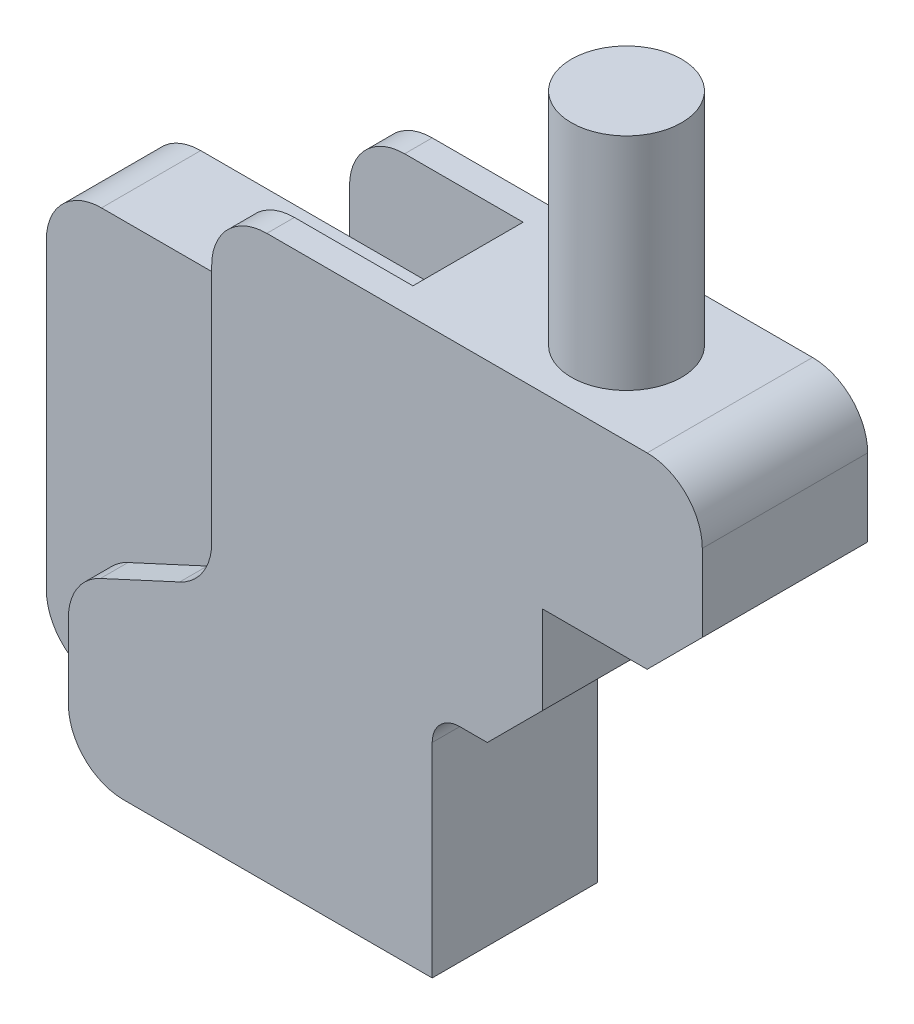
ISO-10303-21;
HEADER;
FILE_DESCRIPTION(('STEP AP214'),'2;1');
FILE_NAME('part.step','',(''),(''),'','','');
FILE_SCHEMA(('AUTOMOTIVE_DESIGN { 1 0 10303 214 1 1 1 1 }'));
ENDSEC;
DATA;
#1=APPLICATION_CONTEXT('core data for automotive mechanical design processes');
#2=APPLICATION_PROTOCOL_DEFINITION('international standard','automotive_design',2000,#1);
#3=PRODUCT_CONTEXT('',#1,'mechanical');
#4=PRODUCT('Part','Part','',(#3));
#5=PRODUCT_RELATED_PRODUCT_CATEGORY('part','',(#4));
#6=PRODUCT_DEFINITION_FORMATION('','',#4);
#7=PRODUCT_DEFINITION_CONTEXT('part definition',#1,'design');
#8=PRODUCT_DEFINITION('design','',#6,#7);
#9=PRODUCT_DEFINITION_SHAPE('','',#8);
#10=(LENGTH_UNIT() NAMED_UNIT(*) SI_UNIT(.MILLI.,.METRE.));
#11=(NAMED_UNIT(*) PLANE_ANGLE_UNIT() SI_UNIT($,.RADIAN.));
#12=(NAMED_UNIT(*) SI_UNIT($,.STERADIAN.) SOLID_ANGLE_UNIT());
#13=UNCERTAINTY_MEASURE_WITH_UNIT(LENGTH_MEASURE(1.E-05),#10,'distance_accuracy_value','');
#14=(GEOMETRIC_REPRESENTATION_CONTEXT(3) GLOBAL_UNCERTAINTY_ASSIGNED_CONTEXT((#13)) GLOBAL_UNIT_ASSIGNED_CONTEXT((#10,
#11,#12)) REPRESENTATION_CONTEXT('',''));
#15=CARTESIAN_POINT('',(0.,0.,0.));
#16=DIRECTION('',(0.,0.,1.));
#17=DIRECTION('',(1.,0.,0.));
#18=AXIS2_PLACEMENT_3D('',#15,#16,#17);
#19=CARTESIAN_POINT('',(0.,-41.,0.));
#20=DIRECTION('',(0.,1.,0.));
#21=DIRECTION('',(-1.,0.,0.));
#22=AXIS2_PLACEMENT_3D('',#19,#20,#21);
#23=PLANE('',#22);
#24=DIRECTION('',(0.,0.,-1.));
#25=VECTOR('',#24,1.);
#26=CARTESIAN_POINT('',(-57.5,-41.,30.));
#27=LINE('',#26,#25);
#28=CARTESIAN_POINT('',(-57.5,-41.,6.));
#29=VERTEX_POINT('',#28);
#30=CARTESIAN_POINT('',(-57.5,-41.,5.));
#31=VERTEX_POINT('',#30);
#32=EDGE_CURVE('E521',#29,#31,#27,.T.);
#33=ORIENTED_EDGE('',*,*,#32,.F.);
#34=DIRECTION('',(-1.,0.,0.));
#35=VECTOR('',#34,1.);
#36=CARTESIAN_POINT('',(-67.5,-41.,6.));
#37=LINE('',#36,#35);
#38=CARTESIAN_POINT('',(-1.00000000000001,-41.,6.));
#39=VERTEX_POINT('',#38);
#40=EDGE_CURVE('E271',#39,#29,#37,.T.);
#41=ORIENTED_EDGE('',*,*,#40,.F.);
#42=DIRECTION('',(0.,0.,-1.));
#43=VECTOR('',#42,1.);
#44=CARTESIAN_POINT('',(-1.00000000000001,-41.,6.));
#45=LINE('',#44,#43);
#46=CARTESIAN_POINT('',(-1.00000000000001,-41.,24.));
#47=VERTEX_POINT('',#46);
#48=EDGE_CURVE('E275',#47,#39,#45,.T.);
#49=ORIENTED_EDGE('',*,*,#48,.F.);
#50=DIRECTION('',(-1.,0.,0.));
#51=VECTOR('',#50,1.);
#52=CARTESIAN_POINT('',(0.,-41.,24.));
#53=LINE('',#52,#51);
#54=CARTESIAN_POINT('',(-57.5,-41.,24.));
#55=VERTEX_POINT('',#54);
#56=EDGE_CURVE('E567',#47,#55,#53,.T.);
#57=ORIENTED_EDGE('',*,*,#56,.T.);
#58=CARTESIAN_POINT('',(-57.5,-41.,25.));
#59=VERTEX_POINT('',#58);
#60=EDGE_CURVE('E520',#59,#55,#27,.T.);
#61=ORIENTED_EDGE('',*,*,#60,.F.);
#62=DIRECTION('',(1.,0.,0.));
#63=VECTOR('',#62,1.);
#64=CARTESIAN_POINT('',(-61.9360451220486,-41.,25.));
#65=LINE('',#64,#63);
#66=CARTESIAN_POINT('',(0.,-41.,25.));
#67=VERTEX_POINT('',#66);
#68=EDGE_CURVE('E299',#59,#67,#65,.T.);
#69=ORIENTED_EDGE('',*,*,#68,.T.);
#70=DIRECTION('',(0.,0.,-1.));
#71=VECTOR('',#70,1.);
#72=CARTESIAN_POINT('',(0.,-41.,5.));
#73=LINE('',#72,#71);
#74=CARTESIAN_POINT('',(0.,-41.,5.));
#75=VERTEX_POINT('',#74);
#76=EDGE_CURVE('E290',#67,#75,#73,.T.);
#77=ORIENTED_EDGE('',*,*,#76,.T.);
#78=DIRECTION('',(-1.,0.,0.));
#79=VECTOR('',#78,1.);
#80=CARTESIAN_POINT('',(-61.9360451220486,-41.,5.));
#81=LINE('',#80,#79);
#82=EDGE_CURVE('E294',#75,#31,#81,.T.);
#83=ORIENTED_EDGE('',*,*,#82,.T.);
#84=EDGE_LOOP('',(#33,#41,#49,#57,#61,#69,#77,#83));
#85=FACE_BOUND('',#84,.T.);
#86=ADVANCED_FACE('F38',(#85),#23,.T.);
#87=CARTESIAN_POINT('',(-21.5,41.,30.));
#88=DIRECTION('',(0.,0.,-1.));
#89=DIRECTION('',(-1.,0.,0.));
#90=AXIS2_PLACEMENT_3D('',#87,#88,#89);
#91=CYLINDRICAL_SURFACE('',#90,10.);
#92=DIRECTION('',(0.,0.,-1.));
#93=VECTOR('',#92,1.);
#94=CARTESIAN_POINT('',(-21.4999999999999,51.,30.));
#95=LINE('',#94,#93);
#96=CARTESIAN_POINT('',(-21.4999999999999,51.,30.));
#97=VERTEX_POINT('',#96);
#98=CARTESIAN_POINT('',(-21.5,51.,25.));
#99=VERTEX_POINT('',#98);
#100=EDGE_CURVE('E547',#97,#99,#95,.T.);
#101=ORIENTED_EDGE('',*,*,#100,.T.);
#102=CARTESIAN_POINT('',(-21.5,41.,25.));
#103=DIRECTION('',(0.,0.,1.));
#104=DIRECTION('',(1.,0.,0.));
#105=AXIS2_PLACEMENT_3D('',#102,#103,#104);
#106=CIRCLE('',#105,10.);
#107=CARTESIAN_POINT('',(-31.5,40.9999999999999,25.));
#108=VERTEX_POINT('',#107);
#109=EDGE_CURVE('E361',#99,#108,#106,.T.);
#110=ORIENTED_EDGE('',*,*,#109,.T.);
#111=DIRECTION('',(0.,0.,-1.));
#112=VECTOR('',#111,1.);
#113=CARTESIAN_POINT('',(-31.5,40.9999999999999,30.));
#114=LINE('',#113,#112);
#115=CARTESIAN_POINT('',(-31.5,40.9999999999999,30.));
#116=VERTEX_POINT('',#115);
#117=EDGE_CURVE('E542',#116,#108,#114,.T.);
#118=ORIENTED_EDGE('',*,*,#117,.F.);
#119=CARTESIAN_POINT('',(-21.5,41.,30.));
#120=DIRECTION('',(0.,0.,1.));
#121=DIRECTION('',(-1.,0.,0.));
#122=AXIS2_PLACEMENT_3D('',#119,#120,#121);
#123=CIRCLE('',#122,10.);
#124=EDGE_CURVE('E380',#97,#116,#123,.T.);
#125=ORIENTED_EDGE('',*,*,#124,.F.);
#126=EDGE_LOOP('',(#101,#110,#118,#125));
#127=FACE_BOUND('',#126,.T.);
#128=ADVANCED_FACE('F658',(#127),#91,.T.);
#129=CARTESIAN_POINT('',(-31.5,-2.60167610517199,30.));
#130=DIRECTION('',(1.,0.,0.));
#131=DIRECTION('',(0.,1.,0.));
#132=AXIS2_PLACEMENT_3D('',#129,#130,#131);
#133=PLANE('',#132);
#134=ORIENTED_EDGE('',*,*,#117,.T.);
#135=DIRECTION('',(0.,-1.,0.));
#136=VECTOR('',#135,1.);
#137=CARTESIAN_POINT('',(-31.5,-2.60167610517199,25.));
#138=LINE('',#137,#136);
#139=CARTESIAN_POINT('',(-31.5,-2.60167610517204,25.));
#140=VERTEX_POINT('',#139);
#141=EDGE_CURVE('E357',#108,#140,#138,.T.);
#142=ORIENTED_EDGE('',*,*,#141,.T.);
#143=DIRECTION('',(0.,0.,-1.));
#144=VECTOR('',#143,1.);
#145=CARTESIAN_POINT('',(-31.5,-2.60167610517204,30.));
#146=LINE('',#145,#144);
#147=CARTESIAN_POINT('',(-31.5,-2.60167610517204,30.));
#148=VERTEX_POINT('',#147);
#149=EDGE_CURVE('E537',#148,#140,#146,.T.);
#150=ORIENTED_EDGE('',*,*,#149,.F.);
#151=DIRECTION('',(0.,-1.,0.));
#152=VECTOR('',#151,1.);
#153=CARTESIAN_POINT('',(-31.5,-2.60167610517199,30.));
#154=LINE('',#153,#152);
#155=EDGE_CURVE('E383',#116,#148,#154,.T.);
#156=ORIENTED_EDGE('',*,*,#155,.F.);
#157=EDGE_LOOP('',(#134,#142,#150,#156));
#158=FACE_BOUND('',#157,.T.);
#159=ADVANCED_FACE('F654',(#158),#133,.F.);
#160=CARTESIAN_POINT('',(-41.5,-2.60167610517204,30.));
#161=DIRECTION('',(0.,0.,-1.));
#162=DIRECTION('',(-1.,0.,0.));
#163=AXIS2_PLACEMENT_3D('',#160,#161,#162);
#164=CYLINDRICAL_SURFACE('',#163,9.99999999999999);
#165=ORIENTED_EDGE('',*,*,#149,.T.);
#166=CARTESIAN_POINT('',(-41.5,-2.60167610517204,25.));
#167=DIRECTION('',(0.,0.,1.));
#168=DIRECTION('',(1.,0.,0.));
#169=AXIS2_PLACEMENT_3D('',#166,#167,#168);
#170=CIRCLE('',#169,9.99999999999999);
#171=CARTESIAN_POINT('',(-37.3094182253826,-11.6812699501766,25.));
#172=VERTEX_POINT('',#171);
#173=EDGE_CURVE('E353',#140,#172,#170,.F.);
#174=ORIENTED_EDGE('',*,*,#173,.T.);
#175=DIRECTION('',(0.,0.,-1.));
#176=VECTOR('',#175,1.);
#177=CARTESIAN_POINT('',(-37.3094182253826,-11.6812699501766,30.));
#178=LINE('',#177,#176);
#179=CARTESIAN_POINT('',(-37.3094182253826,-11.6812699501766,30.));
#180=VERTEX_POINT('',#179);
#181=EDGE_CURVE('E532',#180,#172,#178,.T.);
#182=ORIENTED_EDGE('',*,*,#181,.F.);
#183=CARTESIAN_POINT('',(-41.5,-2.60167610517204,30.));
#184=DIRECTION('',(0.,0.,-1.));
#185=DIRECTION('',(1.,0.,0.));
#186=AXIS2_PLACEMENT_3D('',#183,#184,#185);
#187=CIRCLE('',#186,9.99999999999999);
#188=EDGE_CURVE('E386',#148,#180,#187,.T.);
#189=ORIENTED_EDGE('',*,*,#188,.F.);
#190=EDGE_LOOP('',(#165,#174,#182,#189));
#191=FACE_BOUND('',#190,.T.);
#192=ADVANCED_FACE('F649',(#191),#164,.F.);
#193=CARTESIAN_POINT('',(-51.6905817746174,-18.3187300498234,30.));
#194=DIRECTION('',(0.419058177461748,-0.907959384500451,0.));
#195=DIRECTION('',(0.907959384500451,0.419058177461748,0.));
#196=AXIS2_PLACEMENT_3D('',#193,#194,#195);
#197=PLANE('',#196);
#198=ORIENTED_EDGE('',*,*,#181,.T.);
#199=DIRECTION('',(-0.907959384500451,-0.419058177461748,0.));
#200=VECTOR('',#199,1.);
#201=CARTESIAN_POINT('',(-51.6905817746174,-18.3187300498234,25.));
#202=LINE('',#201,#200);
#203=CARTESIAN_POINT('',(-51.6905817746174,-18.3187300498234,25.));
#204=VERTEX_POINT('',#203);
#205=EDGE_CURVE('E349',#172,#204,#202,.T.);
#206=ORIENTED_EDGE('',*,*,#205,.T.);
#207=DIRECTION('',(0.,0.,-1.));
#208=VECTOR('',#207,1.);
#209=CARTESIAN_POINT('',(-51.6905817746174,-18.3187300498234,30.));
#210=LINE('',#209,#208);
#211=CARTESIAN_POINT('',(-51.6905817746174,-18.3187300498234,30.));
#212=VERTEX_POINT('',#211);
#213=EDGE_CURVE('E527',#212,#204,#210,.T.);
#214=ORIENTED_EDGE('',*,*,#213,.F.);
#215=DIRECTION('',(-0.907959384500451,-0.419058177461748,0.));
#216=VECTOR('',#215,1.);
#217=CARTESIAN_POINT('',(-51.6905817746174,-18.3187300498234,30.));
#218=LINE('',#217,#216);
#219=EDGE_CURVE('E389',#180,#212,#218,.T.);
#220=ORIENTED_EDGE('',*,*,#219,.F.);
#221=EDGE_LOOP('',(#198,#206,#214,#220));
#222=FACE_BOUND('',#221,.T.);
#223=ADVANCED_FACE('F646',(#222),#197,.F.);
#224=CARTESIAN_POINT('',(-47.5,-27.398323894828,30.));
#225=DIRECTION('',(0.,0.,-1.));
#226=DIRECTION('',(-1.,0.,0.));
#227=AXIS2_PLACEMENT_3D('',#224,#225,#226);
#228=CYLINDRICAL_SURFACE('',#227,10.);
#229=ORIENTED_EDGE('',*,*,#213,.T.);
#230=CARTESIAN_POINT('',(-47.5,-27.398323894828,25.));
#231=DIRECTION('',(0.,0.,1.));
#232=DIRECTION('',(1.,0.,0.));
#233=AXIS2_PLACEMENT_3D('',#230,#231,#232);
#234=CIRCLE('',#233,10.);
#235=CARTESIAN_POINT('',(-57.5,-27.398323894828,25.));
#236=VERTEX_POINT('',#235);
#237=EDGE_CURVE('E345',#204,#236,#234,.T.);
#238=ORIENTED_EDGE('',*,*,#237,.T.);
#239=DIRECTION('',(0.,0.,-1.));
#240=VECTOR('',#239,1.);
#241=CARTESIAN_POINT('',(-57.5,-27.398323894828,30.));
#242=LINE('',#241,#240);
#243=CARTESIAN_POINT('',(-57.5,-27.398323894828,30.));
#244=VERTEX_POINT('',#243);
#245=EDGE_CURVE('E522',#244,#236,#242,.T.);
#246=ORIENTED_EDGE('',*,*,#245,.F.);
#247=CARTESIAN_POINT('',(-47.5,-27.398323894828,30.));
#248=DIRECTION('',(0.,0.,1.));
#249=DIRECTION('',(-1.,0.,0.));
#250=AXIS2_PLACEMENT_3D('',#247,#248,#249);
#251=CIRCLE('',#250,10.);
#252=EDGE_CURVE('E392',#212,#244,#251,.T.);
#253=ORIENTED_EDGE('',*,*,#252,.F.);
#254=EDGE_LOOP('',(#229,#238,#246,#253));
#255=FACE_BOUND('',#254,.T.);
#256=ADVANCED_FACE('F641',(#255),#228,.T.);
#257=CARTESIAN_POINT('',(-57.5,-40.9999999999999,30.));
#258=DIRECTION('',(1.,0.,0.));
#259=DIRECTION('',(0.,0.,-1.));
#260=AXIS2_PLACEMENT_3D('',#257,#258,#259);
#261=PLANE('',#260);
#262=ORIENTED_EDGE('',*,*,#245,.T.);
#263=DIRECTION('',(0.,-1.,0.));
#264=VECTOR('',#263,1.);
#265=CARTESIAN_POINT('',(-57.5,-40.9999999999999,25.));
#266=LINE('',#265,#264);
#267=EDGE_CURVE('E341',#236,#59,#266,.T.);
#268=ORIENTED_EDGE('',*,*,#267,.T.);
#269=CARTESIAN_POINT('',(-57.5,-41.,30.));
#270=VERTEX_POINT('',#269);
#271=EDGE_CURVE('E515',#270,#59,#27,.T.);
#272=ORIENTED_EDGE('',*,*,#271,.F.);
#273=DIRECTION('',(0.,-1.,0.));
#274=VECTOR('',#273,1.);
#275=CARTESIAN_POINT('',(-57.5,-40.9999999999999,30.));
#276=LINE('',#275,#274);
#277=EDGE_CURVE('E395',#244,#270,#276,.T.);
#278=ORIENTED_EDGE('',*,*,#277,.F.);
#279=EDGE_LOOP('',(#262,#268,#272,#278));
#280=FACE_BOUND('',#279,.T.);
#281=ADVANCED_FACE('F634',(#280),#261,.F.);
#282=CARTESIAN_POINT('',(47.5,17.,30.));
#283=DIRECTION('',(-0.707106781186548,0.707106781186547,0.));
#284=DIRECTION('',(-0.707106781186547,-0.707106781186548,0.));
#285=AXIS2_PLACEMENT_3D('',#282,#283,#284);
#286=PLANE('',#285);
#287=DIRECTION('',(0.707106781186547,0.707106781186548,0.));
#288=VECTOR('',#287,1.);
#289=CARTESIAN_POINT('',(47.5,17.,0.));
#290=LINE('',#289,#288);
#291=CARTESIAN_POINT('',(47.5,17.,0.));
#292=VERTEX_POINT('',#291);
#293=CARTESIAN_POINT('',(57.5,27.,0.));
#294=VERTEX_POINT('',#293);
#295=EDGE_CURVE('E365',#292,#294,#290,.T.);
#296=ORIENTED_EDGE('',*,*,#295,.T.);
#297=DIRECTION('',(0.,0.,-1.));
#298=VECTOR('',#297,1.);
#299=CARTESIAN_POINT('',(57.5,27.,30.));
#300=LINE('',#299,#298);
#301=CARTESIAN_POINT('',(57.5,27.,30.));
#302=VERTEX_POINT('',#301);
#303=EDGE_CURVE('E559',#302,#294,#300,.T.);
#304=ORIENTED_EDGE('',*,*,#303,.F.);
#305=DIRECTION('',(0.707106781186547,0.707106781186548,0.));
#306=VECTOR('',#305,1.);
#307=CARTESIAN_POINT('',(47.5,17.,30.));
#308=LINE('',#307,#306);
#309=CARTESIAN_POINT('',(47.5,17.,30.));
#310=VERTEX_POINT('',#309);
#311=EDGE_CURVE('E366',#310,#302,#308,.T.);
#312=ORIENTED_EDGE('',*,*,#311,.F.);
#313=DIRECTION('',(0.,0.,-1.));
#314=VECTOR('',#313,1.);
#315=CARTESIAN_POINT('',(47.5,17.,30.));
#316=LINE('',#315,#314);
#317=EDGE_CURVE('E422',#310,#292,#316,.T.);
#318=ORIENTED_EDGE('',*,*,#317,.T.);
#319=EDGE_LOOP('',(#296,#304,#312,#318));
#320=FACE_BOUND('',#319,.T.);
#321=ADVANCED_FACE('F773',(#320),#286,.F.);
#322=CARTESIAN_POINT('',(57.5,27.,30.));
#323=DIRECTION('',(-1.,0.,0.));
#324=DIRECTION('',(0.,-1.,0.));
#325=AXIS2_PLACEMENT_3D('',#322,#323,#324);
#326=PLANE('',#325);
#327=DIRECTION('',(0.,1.,0.));
#328=VECTOR('',#327,1.);
#329=CARTESIAN_POINT('',(57.5,27.,0.));
#330=LINE('',#329,#328);
#331=CARTESIAN_POINT('',(57.5,40.9999999999999,0.));
#332=VERTEX_POINT('',#331);
#333=EDGE_CURVE('E426',#294,#332,#330,.T.);
#334=ORIENTED_EDGE('',*,*,#333,.T.);
#335=DIRECTION('',(0.,0.,-1.));
#336=VECTOR('',#335,1.);
#337=CARTESIAN_POINT('',(57.5,40.9999999999999,30.));
#338=LINE('',#337,#336);
#339=CARTESIAN_POINT('',(57.5,40.9999999999999,30.));
#340=VERTEX_POINT('',#339);
#341=EDGE_CURVE('E555',#340,#332,#338,.T.);
#342=ORIENTED_EDGE('',*,*,#341,.F.);
#343=DIRECTION('',(0.,1.,0.));
#344=VECTOR('',#343,1.);
#345=CARTESIAN_POINT('',(57.5,27.,30.));
#346=LINE('',#345,#344);
#347=EDGE_CURVE('E370',#302,#340,#346,.T.);
#348=ORIENTED_EDGE('',*,*,#347,.F.);
#349=ORIENTED_EDGE('',*,*,#303,.T.);
#350=EDGE_LOOP('',(#334,#342,#348,#349));
#351=FACE_BOUND('',#350,.T.);
#352=ADVANCED_FACE('F769',(#351),#326,.F.);
#353=CARTESIAN_POINT('',(47.5,41.,30.));
#354=DIRECTION('',(0.,0.,-1.));
#355=DIRECTION('',(-1.,0.,0.));
#356=AXIS2_PLACEMENT_3D('',#353,#354,#355);
#357=CYLINDRICAL_SURFACE('',#356,10.);
#358=CARTESIAN_POINT('',(47.5,41.,0.));
#359=DIRECTION('',(0.,0.,1.));
#360=DIRECTION('',(1.,0.,0.));
#361=AXIS2_PLACEMENT_3D('',#358,#359,#360);
#362=CIRCLE('',#361,10.);
#363=CARTESIAN_POINT('',(47.4999999999999,51.,0.));
#364=VERTEX_POINT('',#363);
#365=EDGE_CURVE('E429',#332,#364,#362,.T.);
#366=ORIENTED_EDGE('',*,*,#365,.T.);
#367=DIRECTION('',(0.,0.,-1.));
#368=VECTOR('',#367,1.);
#369=CARTESIAN_POINT('',(47.4999999999999,51.,30.));
#370=LINE('',#369,#368);
#371=CARTESIAN_POINT('',(47.4999999999999,51.,30.));
#372=VERTEX_POINT('',#371);
#373=EDGE_CURVE('E551',#372,#364,#370,.T.);
#374=ORIENTED_EDGE('',*,*,#373,.F.);
#375=CARTESIAN_POINT('',(47.5,41.,30.));
#376=DIRECTION('',(0.,0.,1.));
#377=DIRECTION('',(1.,0.,0.));
#378=AXIS2_PLACEMENT_3D('',#375,#376,#377);
#379=CIRCLE('',#378,10.);
#380=EDGE_CURVE('E374',#340,#372,#379,.T.);
#381=ORIENTED_EDGE('',*,*,#380,.F.);
#382=ORIENTED_EDGE('',*,*,#341,.T.);
#383=EDGE_LOOP('',(#366,#374,#381,#382));
#384=FACE_BOUND('',#383,.T.);
#385=ADVANCED_FACE('F765',(#384),#357,.T.);
#386=CARTESIAN_POINT('',(47.4999999999999,51.,30.));
#387=DIRECTION('',(0.,-1.,0.));
#388=DIRECTION('',(1.,0.,0.));
#389=AXIS2_PLACEMENT_3D('',#386,#387,#388);
#390=PLANE('',#389);
#391=CARTESIAN_POINT('',(28.75,51.,15.));
#392=DIRECTION('',(0.,-1.,0.));
#393=DIRECTION('',(1.,0.,0.));
#394=AXIS2_PLACEMENT_3D('',#391,#392,#393);
#395=CIRCLE('',#394,10.);
#396=CARTESIAN_POINT('',(38.75,51.,15.));
#397=VERTEX_POINT('',#396);
#398=EDGE_CURVE('E563',#397,#397,#395,.F.);
#399=ORIENTED_EDGE('',*,*,#398,.F.);
#400=EDGE_LOOP('',(#399));
#401=FACE_BOUND('',#400,.T.);
#402=DIRECTION('',(0.,0.,-1.));
#403=VECTOR('',#402,1.);
#404=CARTESIAN_POINT('',(0.,51.,5.));
#405=LINE('',#404,#403);
#406=CARTESIAN_POINT('',(0.,51.,25.));
#407=VERTEX_POINT('',#406);
#408=CARTESIAN_POINT('',(0.,51.,5.));
#409=VERTEX_POINT('',#408);
#410=EDGE_CURVE('E284',#407,#409,#405,.T.);
#411=ORIENTED_EDGE('',*,*,#410,.F.);
#412=DIRECTION('',(1.,0.,0.));
#413=VECTOR('',#412,1.);
#414=CARTESIAN_POINT('',(-61.9360451220486,51.,25.));
#415=LINE('',#414,#413);
#416=EDGE_CURVE('E295',#99,#407,#415,.T.);
#417=ORIENTED_EDGE('',*,*,#416,.F.);
#418=ORIENTED_EDGE('',*,*,#100,.F.);
#419=DIRECTION('',(-1.,0.,0.));
#420=VECTOR('',#419,1.);
#421=CARTESIAN_POINT('',(47.4999999999999,51.,30.));
#422=LINE('',#421,#420);
#423=EDGE_CURVE('E377',#372,#97,#422,.T.);
#424=ORIENTED_EDGE('',*,*,#423,.F.);
#425=ORIENTED_EDGE('',*,*,#373,.T.);
#426=DIRECTION('',(-1.,0.,0.));
#427=VECTOR('',#426,1.);
#428=CARTESIAN_POINT('',(47.4999999999999,51.,0.));
#429=LINE('',#428,#427);
#430=CARTESIAN_POINT('',(-21.4999999999999,51.,0.));
#431=VERTEX_POINT('',#430);
#432=EDGE_CURVE('E432',#364,#431,#429,.T.);
#433=ORIENTED_EDGE('',*,*,#432,.T.);
#434=CARTESIAN_POINT('',(-21.5,51.,5.));
#435=VERTEX_POINT('',#434);
#436=EDGE_CURVE('E546',#435,#431,#95,.T.);
#437=ORIENTED_EDGE('',*,*,#436,.F.);
#438=DIRECTION('',(-1.,0.,0.));
#439=VECTOR('',#438,1.);
#440=CARTESIAN_POINT('',(-61.9360451220486,51.,5.));
#441=LINE('',#440,#439);
#442=EDGE_CURVE('E306',#409,#435,#441,.T.);
#443=ORIENTED_EDGE('',*,*,#442,.F.);
#444=EDGE_LOOP('',(#411,#417,#418,#424,#425,#433,#437,#443));
#445=FACE_BOUND('',#444,.T.);
#446=ADVANCED_FACE('F664',(#401,#445),#390,.F.);
#447=CARTESIAN_POINT('',(-31.5,40.9999999999999,5.));
#448=VERTEX_POINT('',#447);
#449=CARTESIAN_POINT('',(-31.5,40.9999999999999,0.));
#450=VERTEX_POINT('',#449);
#451=EDGE_CURVE('E541',#448,#450,#114,.T.);
#452=ORIENTED_EDGE('',*,*,#451,.F.);
#453=CARTESIAN_POINT('',(-21.5,41.,5.));
#454=DIRECTION('',(0.,0.,-1.));
#455=DIRECTION('',(-1.,0.,0.));
#456=AXIS2_PLACEMENT_3D('',#453,#454,#455);
#457=CIRCLE('',#456,10.);
#458=EDGE_CURVE('E337',#448,#435,#457,.T.);
#459=ORIENTED_EDGE('',*,*,#458,.T.);
#460=ORIENTED_EDGE('',*,*,#436,.T.);
#461=CARTESIAN_POINT('',(-21.5,41.,0.));
#462=DIRECTION('',(0.,0.,1.));
#463=DIRECTION('',(-1.,0.,0.));
#464=AXIS2_PLACEMENT_3D('',#461,#462,#463);
#465=CIRCLE('',#464,10.);
#466=EDGE_CURVE('E436',#431,#450,#465,.T.);
#467=ORIENTED_EDGE('',*,*,#466,.T.);
#468=EDGE_LOOP('',(#452,#459,#460,#467));
#469=FACE_BOUND('',#468,.T.);
#470=ADVANCED_FACE('F700',(#469),#91,.T.);
#471=CARTESIAN_POINT('',(-31.5,-2.60167610517204,5.));
#472=VERTEX_POINT('',#471);
#473=CARTESIAN_POINT('',(-31.5,-2.60167610517204,0.));
#474=VERTEX_POINT('',#473);
#475=EDGE_CURVE('E536',#472,#474,#146,.T.);
#476=ORIENTED_EDGE('',*,*,#475,.F.);
#477=DIRECTION('',(0.,1.,0.));
#478=VECTOR('',#477,1.);
#479=CARTESIAN_POINT('',(-31.5,-2.60167610517199,5.));
#480=LINE('',#479,#478);
#481=EDGE_CURVE('E333',#472,#448,#480,.T.);
#482=ORIENTED_EDGE('',*,*,#481,.T.);
#483=ORIENTED_EDGE('',*,*,#451,.T.);
#484=DIRECTION('',(0.,-1.,0.));
#485=VECTOR('',#484,1.);
#486=CARTESIAN_POINT('',(-31.5,-2.60167610517199,0.));
#487=LINE('',#486,#485);
#488=EDGE_CURVE('E440',#450,#474,#487,.T.);
#489=ORIENTED_EDGE('',*,*,#488,.T.);
#490=EDGE_LOOP('',(#476,#482,#483,#489));
#491=FACE_BOUND('',#490,.T.);
#492=ADVANCED_FACE('F756',(#491),#133,.F.);
#493=CARTESIAN_POINT('',(-37.3094182253826,-11.6812699501766,5.));
#494=VERTEX_POINT('',#493);
#495=CARTESIAN_POINT('',(-37.3094182253826,-11.6812699501766,0.));
#496=VERTEX_POINT('',#495);
#497=EDGE_CURVE('E531',#494,#496,#178,.T.);
#498=ORIENTED_EDGE('',*,*,#497,.F.);
#499=CARTESIAN_POINT('',(-41.5,-2.60167610517204,5.));
#500=DIRECTION('',(0.,0.,-1.));
#501=DIRECTION('',(-1.,0.,0.));
#502=AXIS2_PLACEMENT_3D('',#499,#500,#501);
#503=CIRCLE('',#502,9.99999999999999);
#504=EDGE_CURVE('E329',#494,#472,#503,.F.);
#505=ORIENTED_EDGE('',*,*,#504,.T.);
#506=ORIENTED_EDGE('',*,*,#475,.T.);
#507=CARTESIAN_POINT('',(-41.5,-2.60167610517204,0.));
#508=DIRECTION('',(0.,0.,-1.));
#509=DIRECTION('',(1.,0.,0.));
#510=AXIS2_PLACEMENT_3D('',#507,#508,#509);
#511=CIRCLE('',#510,9.99999999999999);
#512=EDGE_CURVE('E444',#474,#496,#511,.T.);
#513=ORIENTED_EDGE('',*,*,#512,.T.);
#514=EDGE_LOOP('',(#498,#505,#506,#513));
#515=FACE_BOUND('',#514,.T.);
#516=ADVANCED_FACE('F752',(#515),#164,.F.);
#517=CARTESIAN_POINT('',(-51.6905817746174,-18.3187300498234,5.));
#518=VERTEX_POINT('',#517);
#519=CARTESIAN_POINT('',(-51.6905817746174,-18.3187300498234,0.));
#520=VERTEX_POINT('',#519);
#521=EDGE_CURVE('E526',#518,#520,#210,.T.);
#522=ORIENTED_EDGE('',*,*,#521,.F.);
#523=DIRECTION('',(0.907959384500451,0.419058177461748,0.));
#524=VECTOR('',#523,1.);
#525=CARTESIAN_POINT('',(-51.6905817746174,-18.3187300498234,5.));
#526=LINE('',#525,#524);
#527=EDGE_CURVE('E325',#518,#494,#526,.T.);
#528=ORIENTED_EDGE('',*,*,#527,.T.);
#529=ORIENTED_EDGE('',*,*,#497,.T.);
#530=DIRECTION('',(-0.907959384500451,-0.419058177461748,0.));
#531=VECTOR('',#530,1.);
#532=CARTESIAN_POINT('',(-51.6905817746174,-18.3187300498234,0.));
#533=LINE('',#532,#531);
#534=EDGE_CURVE('E448',#496,#520,#533,.T.);
#535=ORIENTED_EDGE('',*,*,#534,.T.);
#536=EDGE_LOOP('',(#522,#528,#529,#535));
#537=FACE_BOUND('',#536,.T.);
#538=ADVANCED_FACE('F748',(#537),#197,.F.);
#539=CARTESIAN_POINT('',(-57.5,-27.398323894828,5.));
#540=VERTEX_POINT('',#539);
#541=CARTESIAN_POINT('',(-57.5,-27.398323894828,0.));
#542=VERTEX_POINT('',#541);
#543=EDGE_CURVE('E519',#540,#542,#242,.T.);
#544=ORIENTED_EDGE('',*,*,#543,.F.);
#545=CARTESIAN_POINT('',(-47.5,-27.398323894828,5.));
#546=DIRECTION('',(0.,0.,-1.));
#547=DIRECTION('',(-1.,0.,0.));
#548=AXIS2_PLACEMENT_3D('',#545,#546,#547);
#549=CIRCLE('',#548,10.);
#550=EDGE_CURVE('E321',#540,#518,#549,.T.);
#551=ORIENTED_EDGE('',*,*,#550,.T.);
#552=ORIENTED_EDGE('',*,*,#521,.T.);
#553=CARTESIAN_POINT('',(-47.5,-27.398323894828,0.));
#554=DIRECTION('',(0.,0.,1.));
#555=DIRECTION('',(-1.,0.,0.));
#556=AXIS2_PLACEMENT_3D('',#553,#554,#555);
#557=CIRCLE('',#556,10.);
#558=EDGE_CURVE('E452',#520,#542,#557,.T.);
#559=ORIENTED_EDGE('',*,*,#558,.T.);
#560=EDGE_LOOP('',(#544,#551,#552,#559));
#561=FACE_BOUND('',#560,.T.);
#562=ADVANCED_FACE('F745',(#561),#228,.T.);
#563=CARTESIAN_POINT('',(-57.5,-41.,0.));
#564=VERTEX_POINT('',#563);
#565=EDGE_CURVE('E514',#31,#564,#27,.T.);
#566=ORIENTED_EDGE('',*,*,#565,.F.);
#567=DIRECTION('',(0.,1.,0.));
#568=VECTOR('',#567,1.);
#569=CARTESIAN_POINT('',(-57.5,-40.9999999999999,5.));
#570=LINE('',#569,#568);
#571=EDGE_CURVE('E315',#31,#540,#570,.T.);
#572=ORIENTED_EDGE('',*,*,#571,.T.);
#573=ORIENTED_EDGE('',*,*,#543,.T.);
#574=DIRECTION('',(0.,-1.,0.));
#575=VECTOR('',#574,1.);
#576=CARTESIAN_POINT('',(-57.5,-40.9999999999999,0.));
#577=LINE('',#576,#575);
#578=EDGE_CURVE('E456',#542,#564,#577,.T.);
#579=ORIENTED_EDGE('',*,*,#578,.T.);
#580=EDGE_LOOP('',(#566,#572,#573,#579));
#581=FACE_BOUND('',#580,.T.);
#582=ADVANCED_FACE('F608',(#581),#261,.F.);
#583=CARTESIAN_POINT('',(-47.5,-41.,30.));
#584=DIRECTION('',(0.,0.,-1.));
#585=DIRECTION('',(-1.,0.,0.));
#586=AXIS2_PLACEMENT_3D('',#583,#584,#585);
#587=CYLINDRICAL_SURFACE('',#586,10.);
#588=CARTESIAN_POINT('',(-47.5,-41.,0.));
#589=DIRECTION('',(0.,0.,1.));
#590=DIRECTION('',(-1.,0.,0.));
#591=AXIS2_PLACEMENT_3D('',#588,#589,#590);
#592=CIRCLE('',#591,10.);
#593=CARTESIAN_POINT('',(-47.4999999999999,-51.,0.));
#594=VERTEX_POINT('',#593);
#595=EDGE_CURVE('E460',#564,#594,#592,.T.);
#596=ORIENTED_EDGE('',*,*,#595,.T.);
#597=DIRECTION('',(0.,0.,-1.));
#598=VECTOR('',#597,1.);
#599=CARTESIAN_POINT('',(-47.4999999999999,-51.,30.));
#600=LINE('',#599,#598);
#601=CARTESIAN_POINT('',(-47.4999999999999,-51.,30.));
#602=VERTEX_POINT('',#601);
#603=EDGE_CURVE('E510',#602,#594,#600,.T.);
#604=ORIENTED_EDGE('',*,*,#603,.F.);
#605=CARTESIAN_POINT('',(-47.5,-41.,30.));
#606=DIRECTION('',(0.,0.,1.));
#607=DIRECTION('',(-1.,0.,0.));
#608=AXIS2_PLACEMENT_3D('',#605,#606,#607);
#609=CIRCLE('',#608,10.);
#610=EDGE_CURVE('E398',#270,#602,#609,.T.);
#611=ORIENTED_EDGE('',*,*,#610,.F.);
#612=ORIENTED_EDGE('',*,*,#271,.T.);
#613=ORIENTED_EDGE('',*,*,#60,.T.);
#614=EDGE_CURVE('E596',#55,#29,#27,.T.);
#615=ORIENTED_EDGE('',*,*,#614,.T.);
#616=ORIENTED_EDGE('',*,*,#32,.T.);
#617=ORIENTED_EDGE('',*,*,#565,.T.);
#618=EDGE_LOOP('',(#596,#604,#611,#612,#613,#615,#616,#617));
#619=FACE_BOUND('',#618,.T.);
#620=ADVANCED_FACE('F602',(#619),#587,.T.);
#621=CARTESIAN_POINT('',(8.50000000000002,-51.,30.));
#622=DIRECTION('',(0.,1.,0.));
#623=DIRECTION('',(-1.,0.,0.));
#624=AXIS2_PLACEMENT_3D('',#621,#622,#623);
#625=PLANE('',#624);
#626=DIRECTION('',(1.,0.,0.));
#627=VECTOR('',#626,1.);
#628=CARTESIAN_POINT('',(8.50000000000002,-51.,0.));
#629=LINE('',#628,#627);
#630=CARTESIAN_POINT('',(8.50000000000002,-51.,0.));
#631=VERTEX_POINT('',#630);
#632=EDGE_CURVE('E463',#594,#631,#629,.T.);
#633=ORIENTED_EDGE('',*,*,#632,.T.);
#634=DIRECTION('',(0.,0.,-1.));
#635=VECTOR('',#634,1.);
#636=CARTESIAN_POINT('',(8.50000000000002,-51.,30.));
#637=LINE('',#636,#635);
#638=CARTESIAN_POINT('',(8.50000000000002,-51.,30.));
#639=VERTEX_POINT('',#638);
#640=EDGE_CURVE('E506',#639,#631,#637,.T.);
#641=ORIENTED_EDGE('',*,*,#640,.F.);
#642=DIRECTION('',(1.,0.,0.));
#643=VECTOR('',#642,1.);
#644=CARTESIAN_POINT('',(8.50000000000002,-51.,30.));
#645=LINE('',#644,#643);
#646=EDGE_CURVE('E401',#602,#639,#645,.T.);
#647=ORIENTED_EDGE('',*,*,#646,.F.);
#648=ORIENTED_EDGE('',*,*,#603,.T.);
#649=EDGE_LOOP('',(#633,#641,#647,#648));
#650=FACE_BOUND('',#649,.T.);
#651=ADVANCED_FACE('F619',(#650),#625,.F.);
#652=CARTESIAN_POINT('',(8.50000000000002,-51.,30.));
#653=DIRECTION('',(-1.,0.,0.));
#654=DIRECTION('',(0.,-1.,0.));
#655=AXIS2_PLACEMENT_3D('',#652,#653,#654);
#656=PLANE('',#655);
#657=DIRECTION('',(0.,1.,0.));
#658=VECTOR('',#657,1.);
#659=CARTESIAN_POINT('',(8.50000000000002,-51.,0.));
#660=LINE('',#659,#658);
#661=CARTESIAN_POINT('',(8.50000000000001,-14.,0.));
#662=VERTEX_POINT('',#661);
#663=EDGE_CURVE('E466',#631,#662,#660,.T.);
#664=ORIENTED_EDGE('',*,*,#663,.T.);
#665=DIRECTION('',(0.,0.,-1.));
#666=VECTOR('',#665,1.);
#667=CARTESIAN_POINT('',(8.50000000000001,-14.,30.));
#668=LINE('',#667,#666);
#669=CARTESIAN_POINT('',(8.50000000000001,-14.,30.));
#670=VERTEX_POINT('',#669);
#671=EDGE_CURVE('E502',#670,#662,#668,.T.);
#672=ORIENTED_EDGE('',*,*,#671,.F.);
#673=DIRECTION('',(0.,1.,0.));
#674=VECTOR('',#673,1.);
#675=CARTESIAN_POINT('',(8.50000000000002,-51.,30.));
#676=LINE('',#675,#674);
#677=EDGE_CURVE('E404',#639,#670,#676,.T.);
#678=ORIENTED_EDGE('',*,*,#677,.F.);
#679=ORIENTED_EDGE('',*,*,#640,.T.);
#680=EDGE_LOOP('',(#664,#672,#678,#679));
#681=FACE_BOUND('',#680,.T.);
#682=ADVANCED_FACE('F623',(#681),#656,.F.);
#683=CARTESIAN_POINT('',(13.5,-14.,30.));
#684=DIRECTION('',(0.,0.,-1.));
#685=DIRECTION('',(-1.,0.,0.));
#686=AXIS2_PLACEMENT_3D('',#683,#684,#685);
#687=CYLINDRICAL_SURFACE('',#686,5.);
#688=CARTESIAN_POINT('',(13.5,-14.,0.));
#689=DIRECTION('',(0.,0.,-1.));
#690=DIRECTION('',(-1.,0.,0.));
#691=AXIS2_PLACEMENT_3D('',#688,#689,#690);
#692=CIRCLE('',#691,5.);
#693=CARTESIAN_POINT('',(13.5,-9.00000000000001,0.));
#694=VERTEX_POINT('',#693);
#695=EDGE_CURVE('E469',#662,#694,#692,.T.);
#696=ORIENTED_EDGE('',*,*,#695,.T.);
#697=DIRECTION('',(0.,0.,-1.));
#698=VECTOR('',#697,1.);
#699=CARTESIAN_POINT('',(13.5,-9.00000000000001,30.));
#700=LINE('',#699,#698);
#701=CARTESIAN_POINT('',(13.5,-9.00000000000001,30.));
#702=VERTEX_POINT('',#701);
#703=EDGE_CURVE('E498',#702,#694,#700,.T.);
#704=ORIENTED_EDGE('',*,*,#703,.F.);
#705=CARTESIAN_POINT('',(13.5,-14.,30.));
#706=DIRECTION('',(0.,0.,-1.));
#707=DIRECTION('',(-1.,0.,0.));
#708=AXIS2_PLACEMENT_3D('',#705,#706,#707);
#709=CIRCLE('',#708,5.);
#710=EDGE_CURVE('E407',#670,#702,#709,.T.);
#711=ORIENTED_EDGE('',*,*,#710,.F.);
#712=ORIENTED_EDGE('',*,*,#671,.T.);
#713=EDGE_LOOP('',(#696,#704,#711,#712));
#714=FACE_BOUND('',#713,.T.);
#715=ADVANCED_FACE('F732',(#714),#687,.F.);
#716=CARTESIAN_POINT('',(13.5,-9.00000000000001,30.));
#717=DIRECTION('',(0.,1.,0.));
#718=DIRECTION('',(0.,0.,1.));
#719=AXIS2_PLACEMENT_3D('',#716,#717,#718);
#720=PLANE('',#719);
#721=DIRECTION('',(1.,0.,0.));
#722=VECTOR('',#721,1.);
#723=CARTESIAN_POINT('',(13.5,-9.00000000000001,0.));
#724=LINE('',#723,#722);
#725=CARTESIAN_POINT('',(18.5,-9.00000000000001,0.));
#726=VERTEX_POINT('',#725);
#727=EDGE_CURVE('E472',#694,#726,#724,.T.);
#728=ORIENTED_EDGE('',*,*,#727,.T.);
#729=DIRECTION('',(0.,0.,-1.));
#730=VECTOR('',#729,1.);
#731=CARTESIAN_POINT('',(18.5,-9.00000000000001,30.));
#732=LINE('',#731,#730);
#733=CARTESIAN_POINT('',(18.5,-9.00000000000001,30.));
#734=VERTEX_POINT('',#733);
#735=EDGE_CURVE('E494',#734,#726,#732,.T.);
#736=ORIENTED_EDGE('',*,*,#735,.F.);
#737=DIRECTION('',(1.,0.,0.));
#738=VECTOR('',#737,1.);
#739=CARTESIAN_POINT('',(13.5,-9.00000000000001,30.));
#740=LINE('',#739,#738);
#741=EDGE_CURVE('E410',#702,#734,#740,.T.);
#742=ORIENTED_EDGE('',*,*,#741,.F.);
#743=ORIENTED_EDGE('',*,*,#703,.T.);
#744=EDGE_LOOP('',(#728,#736,#742,#743));
#745=FACE_BOUND('',#744,.T.);
#746=ADVANCED_FACE('F728',(#745),#720,.F.);
#747=CARTESIAN_POINT('',(18.5,-9.00000000000001,30.));
#748=DIRECTION('',(-0.707106781186548,0.707106781186547,0.));
#749=DIRECTION('',(-0.707106781186547,-0.707106781186548,0.));
#750=AXIS2_PLACEMENT_3D('',#747,#748,#749);
#751=PLANE('',#750);
#752=DIRECTION('',(0.707106781186547,0.707106781186548,0.));
#753=VECTOR('',#752,1.);
#754=CARTESIAN_POINT('',(18.5,-9.00000000000001,0.));
#755=LINE('',#754,#753);
#756=CARTESIAN_POINT('',(28.5,0.999999999999989,0.));
#757=VERTEX_POINT('',#756);
#758=EDGE_CURVE('E475',#726,#757,#755,.T.);
#759=ORIENTED_EDGE('',*,*,#758,.T.);
#760=DIRECTION('',(0.,0.,-1.));
#761=VECTOR('',#760,1.);
#762=CARTESIAN_POINT('',(28.5,0.999999999999989,30.));
#763=LINE('',#762,#761);
#764=CARTESIAN_POINT('',(28.5,0.999999999999989,30.));
#765=VERTEX_POINT('',#764);
#766=EDGE_CURVE('E490',#765,#757,#763,.T.);
#767=ORIENTED_EDGE('',*,*,#766,.F.);
#768=DIRECTION('',(0.707106781186547,0.707106781186548,0.));
#769=VECTOR('',#768,1.);
#770=CARTESIAN_POINT('',(18.5,-9.00000000000001,30.));
#771=LINE('',#770,#769);
#772=EDGE_CURVE('E413',#734,#765,#771,.T.);
#773=ORIENTED_EDGE('',*,*,#772,.F.);
#774=ORIENTED_EDGE('',*,*,#735,.T.);
#775=EDGE_LOOP('',(#759,#767,#773,#774));
#776=FACE_BOUND('',#775,.T.);
#777=ADVANCED_FACE('F724',(#776),#751,.F.);
#778=CARTESIAN_POINT('',(28.5,0.999999999999989,30.));
#779=DIRECTION('',(-1.,0.,0.));
#780=DIRECTION('',(0.,0.,1.));
#781=AXIS2_PLACEMENT_3D('',#778,#779,#780);
#782=PLANE('',#781);
#783=DIRECTION('',(0.,1.,0.));
#784=VECTOR('',#783,1.);
#785=CARTESIAN_POINT('',(28.5,0.999999999999989,0.));
#786=LINE('',#785,#784);
#787=CARTESIAN_POINT('',(28.5,17.,0.));
#788=VERTEX_POINT('',#787);
#789=EDGE_CURVE('E478',#757,#788,#786,.T.);
#790=ORIENTED_EDGE('',*,*,#789,.T.);
#791=DIRECTION('',(0.,0.,-1.));
#792=VECTOR('',#791,1.);
#793=CARTESIAN_POINT('',(28.5,17.,30.));
#794=LINE('',#793,#792);
#795=CARTESIAN_POINT('',(28.5,17.,30.));
#796=VERTEX_POINT('',#795);
#797=EDGE_CURVE('E486',#796,#788,#794,.T.);
#798=ORIENTED_EDGE('',*,*,#797,.F.);
#799=DIRECTION('',(0.,1.,0.));
#800=VECTOR('',#799,1.);
#801=CARTESIAN_POINT('',(28.5,0.999999999999989,30.));
#802=LINE('',#801,#800);
#803=EDGE_CURVE('E416',#765,#796,#802,.T.);
#804=ORIENTED_EDGE('',*,*,#803,.F.);
#805=ORIENTED_EDGE('',*,*,#766,.T.);
#806=EDGE_LOOP('',(#790,#798,#804,#805));
#807=FACE_BOUND('',#806,.T.);
#808=ADVANCED_FACE('F720',(#807),#782,.F.);
#809=CARTESIAN_POINT('',(28.5,17.,30.));
#810=DIRECTION('',(0.,1.,0.));
#811=DIRECTION('',(0.,0.,1.));
#812=AXIS2_PLACEMENT_3D('',#809,#810,#811);
#813=PLANE('',#812);
#814=DIRECTION('',(1.,0.,0.));
#815=VECTOR('',#814,1.);
#816=CARTESIAN_POINT('',(28.5,17.,0.));
#817=LINE('',#816,#815);
#818=EDGE_CURVE('E371',#788,#292,#817,.T.);
#819=ORIENTED_EDGE('',*,*,#818,.T.);
#820=ORIENTED_EDGE('',*,*,#317,.F.);
#821=DIRECTION('',(1.,0.,0.));
#822=VECTOR('',#821,1.);
#823=CARTESIAN_POINT('',(28.5,17.,30.));
#824=LINE('',#823,#822);
#825=EDGE_CURVE('E419',#796,#310,#824,.T.);
#826=ORIENTED_EDGE('',*,*,#825,.F.);
#827=ORIENTED_EDGE('',*,*,#797,.T.);
#828=EDGE_LOOP('',(#819,#820,#826,#827));
#829=FACE_BOUND('',#828,.T.);
#830=ADVANCED_FACE('F715',(#829),#813,.F.);
#831=CARTESIAN_POINT('',(47.5,41.,30.));
#832=DIRECTION('',(0.,0.,1.));
#833=DIRECTION('',(1.,0.,0.));
#834=AXIS2_PLACEMENT_3D('',#831,#832,#833);
#835=PLANE('',#834);
#836=ORIENTED_EDGE('',*,*,#311,.T.);
#837=ORIENTED_EDGE('',*,*,#347,.T.);
#838=ORIENTED_EDGE('',*,*,#380,.T.);
#839=ORIENTED_EDGE('',*,*,#423,.T.);
#840=ORIENTED_EDGE('',*,*,#124,.T.);
#841=ORIENTED_EDGE('',*,*,#155,.T.);
#842=ORIENTED_EDGE('',*,*,#188,.T.);
#843=ORIENTED_EDGE('',*,*,#219,.T.);
#844=ORIENTED_EDGE('',*,*,#252,.T.);
#845=ORIENTED_EDGE('',*,*,#277,.T.);
#846=ORIENTED_EDGE('',*,*,#610,.T.);
#847=ORIENTED_EDGE('',*,*,#646,.T.);
#848=ORIENTED_EDGE('',*,*,#677,.T.);
#849=ORIENTED_EDGE('',*,*,#710,.T.);
#850=ORIENTED_EDGE('',*,*,#741,.T.);
#851=ORIENTED_EDGE('',*,*,#772,.T.);
#852=ORIENTED_EDGE('',*,*,#803,.T.);
#853=ORIENTED_EDGE('',*,*,#825,.T.);
#854=EDGE_LOOP('',(#836,#837,#838,#839,#840,#841,#842,#843,#844,#845,#846,#847,#848,#849,#850,
#851,#852,#853));
#855=FACE_BOUND('',#854,.T.);
#856=ADVANCED_FACE('F627',(#855),#835,.T.);
#857=CARTESIAN_POINT('',(47.5,41.,0.));
#858=DIRECTION('',(0.,0.,1.));
#859=DIRECTION('',(1.,0.,0.));
#860=AXIS2_PLACEMENT_3D('',#857,#858,#859);
#861=PLANE('',#860);
#862=ORIENTED_EDGE('',*,*,#295,.F.);
#863=ORIENTED_EDGE('',*,*,#818,.F.);
#864=ORIENTED_EDGE('',*,*,#789,.F.);
#865=ORIENTED_EDGE('',*,*,#758,.F.);
#866=ORIENTED_EDGE('',*,*,#727,.F.);
#867=ORIENTED_EDGE('',*,*,#695,.F.);
#868=ORIENTED_EDGE('',*,*,#663,.F.);
#869=ORIENTED_EDGE('',*,*,#632,.F.);
#870=ORIENTED_EDGE('',*,*,#595,.F.);
#871=ORIENTED_EDGE('',*,*,#578,.F.);
#872=ORIENTED_EDGE('',*,*,#558,.F.);
#873=ORIENTED_EDGE('',*,*,#534,.F.);
#874=ORIENTED_EDGE('',*,*,#512,.F.);
#875=ORIENTED_EDGE('',*,*,#488,.F.);
#876=ORIENTED_EDGE('',*,*,#466,.F.);
#877=ORIENTED_EDGE('',*,*,#432,.F.);
#878=ORIENTED_EDGE('',*,*,#365,.F.);
#879=ORIENTED_EDGE('',*,*,#333,.F.);
#880=EDGE_LOOP('',(#862,#863,#864,#865,#866,#867,#868,#869,#870,#871,#872,#873,#874,#875,#876,
#877,#878,#879));
#881=FACE_BOUND('',#880,.T.);
#882=ADVANCED_FACE('F614',(#881),#861,.F.);
#883=CARTESIAN_POINT('',(-61.9360451220486,-41.,25.));
#884=DIRECTION('',(0.,0.,1.));
#885=DIRECTION('',(1.,0.,0.));
#886=AXIS2_PLACEMENT_3D('',#883,#884,#885);
#887=PLANE('',#886);
#888=ORIENTED_EDGE('',*,*,#416,.T.);
#889=DIRECTION('',(0.,1.,0.));
#890=VECTOR('',#889,1.);
#891=CARTESIAN_POINT('',(0.,-41.,25.));
#892=LINE('',#891,#890);
#893=EDGE_CURVE('E311',#67,#407,#892,.T.);
#894=ORIENTED_EDGE('',*,*,#893,.F.);
#895=ORIENTED_EDGE('',*,*,#68,.F.);
#896=ORIENTED_EDGE('',*,*,#267,.F.);
#897=ORIENTED_EDGE('',*,*,#237,.F.);
#898=ORIENTED_EDGE('',*,*,#205,.F.);
#899=ORIENTED_EDGE('',*,*,#173,.F.);
#900=ORIENTED_EDGE('',*,*,#141,.F.);
#901=ORIENTED_EDGE('',*,*,#109,.F.);
#902=EDGE_LOOP('',(#888,#894,#895,#896,#897,#898,#899,#900,#901));
#903=FACE_BOUND('',#902,.T.);
#904=ADVANCED_FACE('F638',(#903),#887,.F.);
#905=CARTESIAN_POINT('',(-61.9360451220486,-41.,5.));
#906=DIRECTION('',(0.,0.,-1.));
#907=DIRECTION('',(-1.,0.,0.));
#908=AXIS2_PLACEMENT_3D('',#905,#906,#907);
#909=PLANE('',#908);
#910=ORIENTED_EDGE('',*,*,#481,.F.);
#911=ORIENTED_EDGE('',*,*,#504,.F.);
#912=ORIENTED_EDGE('',*,*,#527,.F.);
#913=ORIENTED_EDGE('',*,*,#550,.F.);
#914=ORIENTED_EDGE('',*,*,#571,.F.);
#915=ORIENTED_EDGE('',*,*,#82,.F.);
#916=DIRECTION('',(0.,1.,0.));
#917=VECTOR('',#916,1.);
#918=CARTESIAN_POINT('',(0.,-41.,5.));
#919=LINE('',#918,#917);
#920=EDGE_CURVE('E302',#75,#409,#919,.T.);
#921=ORIENTED_EDGE('',*,*,#920,.T.);
#922=ORIENTED_EDGE('',*,*,#442,.T.);
#923=ORIENTED_EDGE('',*,*,#458,.F.);
#924=EDGE_LOOP('',(#910,#911,#912,#913,#914,#915,#921,#922,#923));
#925=FACE_BOUND('',#924,.T.);
#926=ADVANCED_FACE('F707',(#925),#909,.F.);
#927=CARTESIAN_POINT('',(0.,-41.,5.));
#928=DIRECTION('',(1.,0.,0.));
#929=DIRECTION('',(0.,1.,0.));
#930=AXIS2_PLACEMENT_3D('',#927,#928,#929);
#931=PLANE('',#930);
#932=ORIENTED_EDGE('',*,*,#410,.T.);
#933=ORIENTED_EDGE('',*,*,#920,.F.);
#934=ORIENTED_EDGE('',*,*,#76,.F.);
#935=ORIENTED_EDGE('',*,*,#893,.T.);
#936=EDGE_LOOP('',(#932,#933,#934,#935));
#937=FACE_BOUND('',#936,.T.);
#938=ADVANCED_FACE('F668',(#937),#931,.F.);
#939=CARTESIAN_POINT('',(28.75,91.,15.));
#940=DIRECTION('',(0.,-1.,0.));
#941=DIRECTION('',(1.,0.,0.));
#942=AXIS2_PLACEMENT_3D('',#939,#940,#941);
#943=CYLINDRICAL_SURFACE('',#942,10.);
#944=CARTESIAN_POINT('',(28.75,91.,15.));
#945=DIRECTION('',(0.,1.,0.));
#946=DIRECTION('',(-1.,0.,0.));
#947=AXIS2_PLACEMENT_3D('',#944,#945,#946);
#948=CIRCLE('',#947,10.);
#949=CARTESIAN_POINT('',(18.75,91.,15.));
#950=VERTEX_POINT('',#949);
#951=EDGE_CURVE('E278',#950,#950,#948,.T.);
#952=ORIENTED_EDGE('',*,*,#951,.F.);
#953=EDGE_LOOP('',(#952));
#954=FACE_BOUND('',#953,.T.);
#955=ORIENTED_EDGE('',*,*,#398,.T.);
#956=EDGE_LOOP('',(#955));
#957=FACE_BOUND('',#956,.T.);
#958=ADVANCED_FACE('F703',(#954,#957),#943,.T.);
#959=CARTESIAN_POINT('',(28.75,91.,15.));
#960=DIRECTION('',(0.,1.,0.));
#961=DIRECTION('',(-1.,0.,0.));
#962=AXIS2_PLACEMENT_3D('',#959,#960,#961);
#963=PLANE('',#962);
#964=ORIENTED_EDGE('',*,*,#951,.T.);
#965=EDGE_LOOP('',(#964));
#966=FACE_BOUND('',#965,.T.);
#967=ADVANCED_FACE('F987',(#966),#963,.T.);
#968=CARTESIAN_POINT('',(-0.999999999999997,34.,6.));
#969=DIRECTION('',(-1.,0.,0.));
#970=DIRECTION('',(0.,-1.,0.));
#971=AXIS2_PLACEMENT_3D('',#968,#969,#970);
#972=PLANE('',#971);
#973=ORIENTED_EDGE('',*,*,#48,.T.);
#974=DIRECTION('',(0.,-1.,0.));
#975=VECTOR('',#974,1.);
#976=CARTESIAN_POINT('',(-0.999999999999997,34.,6.));
#977=LINE('',#976,#975);
#978=CARTESIAN_POINT('',(-0.999999999999997,34.,6.));
#979=VERTEX_POINT('',#978);
#980=EDGE_CURVE('E255',#979,#39,#977,.T.);
#981=ORIENTED_EDGE('',*,*,#980,.F.);
#982=DIRECTION('',(0.,0.,-1.));
#983=VECTOR('',#982,1.);
#984=CARTESIAN_POINT('',(-0.999999999999997,34.,6.));
#985=LINE('',#984,#983);
#986=CARTESIAN_POINT('',(-0.999999999999997,34.,24.));
#987=VERTEX_POINT('',#986);
#988=EDGE_CURVE('E263',#987,#979,#985,.T.);
#989=ORIENTED_EDGE('',*,*,#988,.F.);
#990=DIRECTION('',(0.,-1.,0.));
#991=VECTOR('',#990,1.);
#992=CARTESIAN_POINT('',(-0.999999999999997,34.,24.));
#993=LINE('',#992,#991);
#994=EDGE_CURVE('E673',#987,#47,#993,.T.);
#995=ORIENTED_EDGE('',*,*,#994,.T.);
#996=EDGE_LOOP('',(#973,#981,#989,#995));
#997=FACE_BOUND('',#996,.T.);
#998=ADVANCED_FACE('F273',(#997),#972,.F.);
#999=CARTESIAN_POINT('',(-67.5,34.,6.));
#1000=DIRECTION('',(0.,0.,1.));
#1001=DIRECTION('',(1.,0.,0.));
#1002=AXIS2_PLACEMENT_3D('',#999,#1000,#1001);
#1003=PLANE('',#1002);
#1004=DIRECTION('',(0.,-1.,0.));
#1005=VECTOR('',#1004,1.);
#1006=CARTESIAN_POINT('',(-67.5,34.,6.));
#1007=LINE('',#1006,#1005);
#1008=CARTESIAN_POINT('',(-67.5,24.,6.));
#1009=VERTEX_POINT('',#1008);
#1010=CARTESIAN_POINT('',(-67.5,-31.,6.));
#1011=VERTEX_POINT('',#1010);
#1012=EDGE_CURVE('E279',#1009,#1011,#1007,.T.);
#1013=ORIENTED_EDGE('',*,*,#1012,.F.);
#1014=CARTESIAN_POINT('',(-57.5,24.,6.));
#1015=DIRECTION('',(0.,0.,1.));
#1016=DIRECTION('',(1.,0.,0.));
#1017=AXIS2_PLACEMENT_3D('',#1014,#1015,#1016);
#1018=CIRCLE('',#1017,10.);
#1019=CARTESIAN_POINT('',(-57.5,34.,6.));
#1020=VERTEX_POINT('',#1019);
#1021=EDGE_CURVE('E11',#1009,#1020,#1018,.F.);
#1022=ORIENTED_EDGE('',*,*,#1021,.T.);
#1023=DIRECTION('',(-1.,0.,0.));
#1024=VECTOR('',#1023,1.);
#1025=CARTESIAN_POINT('',(-67.5,34.,6.));
#1026=LINE('',#1025,#1024);
#1027=EDGE_CURVE('E251',#979,#1020,#1026,.T.);
#1028=ORIENTED_EDGE('',*,*,#1027,.F.);
#1029=ORIENTED_EDGE('',*,*,#980,.T.);
#1030=ORIENTED_EDGE('',*,*,#40,.T.);
#1031=CARTESIAN_POINT('',(-57.5,-31.,6.));
#1032=DIRECTION('',(0.,0.,1.));
#1033=DIRECTION('',(1.,0.,0.));
#1034=AXIS2_PLACEMENT_3D('',#1031,#1032,#1033);
#1035=CIRCLE('',#1034,10.);
#1036=EDGE_CURVE('E578',#29,#1011,#1035,.F.);
#1037=ORIENTED_EDGE('',*,*,#1036,.T.);
#1038=EDGE_LOOP('',(#1013,#1022,#1028,#1029,#1030,#1037));
#1039=FACE_BOUND('',#1038,.T.);
#1040=ADVANCED_FACE('F253',(#1039),#1003,.F.);
#1041=CARTESIAN_POINT('',(-67.5,34.,6.));
#1042=DIRECTION('',(1.,0.,0.));
#1043=DIRECTION('',(0.,1.,0.));
#1044=AXIS2_PLACEMENT_3D('',#1041,#1042,#1043);
#1045=PLANE('',#1044);
#1046=DIRECTION('',(0.,-1.,0.));
#1047=VECTOR('',#1046,1.);
#1048=CARTESIAN_POINT('',(-67.5,34.,24.));
#1049=LINE('',#1048,#1047);
#1050=CARTESIAN_POINT('',(-67.5,24.,24.));
#1051=VERTEX_POINT('',#1050);
#1052=CARTESIAN_POINT('',(-67.5,-31.,24.));
#1053=VERTEX_POINT('',#1052);
#1054=EDGE_CURVE('E286',#1051,#1053,#1049,.T.);
#1055=ORIENTED_EDGE('',*,*,#1054,.F.);
#1056=DIRECTION('',(0.,0.,1.));
#1057=VECTOR('',#1056,1.);
#1058=CARTESIAN_POINT('',(-67.5,24.,6.));
#1059=LINE('',#1058,#1057);
#1060=EDGE_CURVE('E47',#1051,#1009,#1059,.F.);
#1061=ORIENTED_EDGE('',*,*,#1060,.T.);
#1062=ORIENTED_EDGE('',*,*,#1012,.T.);
#1063=DIRECTION('',(0.,0.,1.));
#1064=VECTOR('',#1063,1.);
#1065=CARTESIAN_POINT('',(-67.5,-31.,6.));
#1066=LINE('',#1065,#1064);
#1067=EDGE_CURVE('E571',#1011,#1053,#1066,.T.);
#1068=ORIENTED_EDGE('',*,*,#1067,.T.);
#1069=EDGE_LOOP('',(#1055,#1061,#1062,#1068));
#1070=FACE_BOUND('',#1069,.T.);
#1071=ADVANCED_FACE('F688',(#1070),#1045,.F.);
#1072=CARTESIAN_POINT('',(-67.5,34.,24.));
#1073=DIRECTION('',(0.,0.,-1.));
#1074=DIRECTION('',(-1.,0.,0.));
#1075=AXIS2_PLACEMENT_3D('',#1072,#1073,#1074);
#1076=PLANE('',#1075);
#1077=DIRECTION('',(1.,0.,0.));
#1078=VECTOR('',#1077,1.);
#1079=CARTESIAN_POINT('',(-67.5,34.,24.));
#1080=LINE('',#1079,#1078);
#1081=CARTESIAN_POINT('',(-57.5,34.,24.));
#1082=VERTEX_POINT('',#1081);
#1083=EDGE_CURVE('E262',#1082,#987,#1080,.T.);
#1084=ORIENTED_EDGE('',*,*,#1083,.F.);
#1085=CARTESIAN_POINT('',(-57.5,24.,24.));
#1086=DIRECTION('',(0.,0.,-1.));
#1087=DIRECTION('',(-1.,0.,0.));
#1088=AXIS2_PLACEMENT_3D('',#1085,#1086,#1087);
#1089=CIRCLE('',#1088,10.);
#1090=EDGE_CURVE('E61',#1082,#1051,#1089,.F.);
#1091=ORIENTED_EDGE('',*,*,#1090,.T.);
#1092=ORIENTED_EDGE('',*,*,#1054,.T.);
#1093=CARTESIAN_POINT('',(-57.5,-31.,24.));
#1094=DIRECTION('',(0.,0.,-1.));
#1095=DIRECTION('',(-1.,0.,0.));
#1096=AXIS2_PLACEMENT_3D('',#1093,#1094,#1095);
#1097=CIRCLE('',#1096,10.);
#1098=EDGE_CURVE('E575',#1053,#55,#1097,.F.);
#1099=ORIENTED_EDGE('',*,*,#1098,.T.);
#1100=ORIENTED_EDGE('',*,*,#56,.F.);
#1101=ORIENTED_EDGE('',*,*,#994,.F.);
#1102=EDGE_LOOP('',(#1084,#1091,#1092,#1099,#1100,#1101));
#1103=FACE_BOUND('',#1102,.T.);
#1104=ADVANCED_FACE('F672',(#1103),#1076,.F.);
#1105=CARTESIAN_POINT('',(0.,34.,0.));
#1106=DIRECTION('',(0.,1.,0.));
#1107=DIRECTION('',(-1.,0.,0.));
#1108=AXIS2_PLACEMENT_3D('',#1105,#1106,#1107);
#1109=PLANE('',#1108);
#1110=ORIENTED_EDGE('',*,*,#1027,.T.);
#1111=DIRECTION('',(0.,0.,1.));
#1112=VECTOR('',#1111,1.);
#1113=CARTESIAN_POINT('',(-57.5,34.,24.));
#1114=LINE('',#1113,#1112);
#1115=EDGE_CURVE('E582',#1020,#1082,#1114,.T.);
#1116=ORIENTED_EDGE('',*,*,#1115,.T.);
#1117=ORIENTED_EDGE('',*,*,#1083,.T.);
#1118=ORIENTED_EDGE('',*,*,#988,.T.);
#1119=EDGE_LOOP('',(#1110,#1116,#1117,#1118));
#1120=FACE_BOUND('',#1119,.T.);
#1121=ADVANCED_FACE('F266',(#1120),#1109,.T.);
#1122=CARTESIAN_POINT('',(-57.5,-31.,6.));
#1123=DIRECTION('',(0.,0.,1.));
#1124=DIRECTION('',(1.,0.,0.));
#1125=AXIS2_PLACEMENT_3D('',#1122,#1123,#1124);
#1126=CYLINDRICAL_SURFACE('',#1125,10.);
#1127=ORIENTED_EDGE('',*,*,#1036,.F.);
#1128=ORIENTED_EDGE('',*,*,#614,.F.);
#1129=ORIENTED_EDGE('',*,*,#1098,.F.);
#1130=ORIENTED_EDGE('',*,*,#1067,.F.);
#1131=EDGE_LOOP('',(#1127,#1128,#1129,#1130));
#1132=FACE_BOUND('',#1131,.T.);
#1133=ADVANCED_FACE('F687',(#1132),#1126,.T.);
#1134=CARTESIAN_POINT('',(-57.5,24.,0.));
#1135=DIRECTION('',(0.,0.,-1.));
#1136=DIRECTION('',(-1.,0.,0.));
#1137=AXIS2_PLACEMENT_3D('',#1134,#1135,#1136);
#1138=CYLINDRICAL_SURFACE('',#1137,10.);
#1139=ORIENTED_EDGE('',*,*,#1021,.F.);
#1140=ORIENTED_EDGE('',*,*,#1060,.F.);
#1141=ORIENTED_EDGE('',*,*,#1090,.F.);
#1142=ORIENTED_EDGE('',*,*,#1115,.F.);
#1143=EDGE_LOOP('',(#1139,#1140,#1141,#1142));
#1144=FACE_BOUND('',#1143,.T.);
#1145=ADVANCED_FACE('F40',(#1144),#1138,.T.);
#1146=CLOSED_SHELL('',(#86,#128,#159,#192,#223,#256,#281,#321,#352,#385,#446,#470,#492,#516,
#538,#562,#582,#620,#651,#682,#715,#746,#777,#808,#830,#856,#882,#904,#926,#938,#958,#967,#998,
#1040,#1071,#1104,#1121,#1133,#1145));
#1147=MANIFOLD_SOLID_BREP('B2',#1146);
#1148=ADVANCED_BREP_SHAPE_REPRESENTATION('',(#18,#1147),#14);
#1149=SHAPE_DEFINITION_REPRESENTATION(#9,#1148);
ENDSEC;
END-ISO-10303-21;
